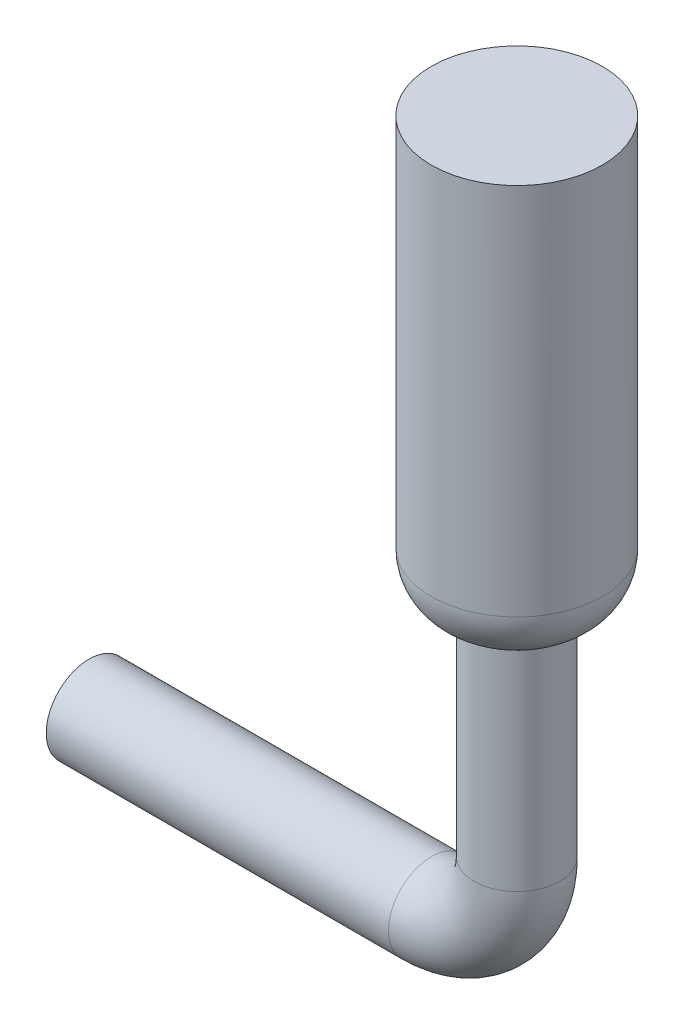
ISO-10303-21;
HEADER;
FILE_DESCRIPTION(('STEP AP214'),'2;1');
FILE_NAME('part.step','',(''),(''),'','','');
FILE_SCHEMA(('AUTOMOTIVE_DESIGN { 1 0 10303 214 1 1 1 1 }'));
ENDSEC;
DATA;
#1=APPLICATION_CONTEXT('core data for automotive mechanical design processes');
#2=APPLICATION_PROTOCOL_DEFINITION('international standard','automotive_design',2000,#1);
#3=PRODUCT_CONTEXT('',#1,'mechanical');
#4=PRODUCT('Part','Part','',(#3));
#5=PRODUCT_RELATED_PRODUCT_CATEGORY('part','',(#4));
#6=PRODUCT_DEFINITION_FORMATION('','',#4);
#7=PRODUCT_DEFINITION_CONTEXT('part definition',#1,'design');
#8=PRODUCT_DEFINITION('design','',#6,#7);
#9=PRODUCT_DEFINITION_SHAPE('','',#8);
#10=(LENGTH_UNIT() NAMED_UNIT(*) SI_UNIT(.MILLI.,.METRE.));
#11=(NAMED_UNIT(*) PLANE_ANGLE_UNIT() SI_UNIT($,.RADIAN.));
#12=(NAMED_UNIT(*) SI_UNIT($,.STERADIAN.) SOLID_ANGLE_UNIT());
#13=UNCERTAINTY_MEASURE_WITH_UNIT(LENGTH_MEASURE(1.E-05),#10,'distance_accuracy_value','');
#14=(GEOMETRIC_REPRESENTATION_CONTEXT(3) GLOBAL_UNCERTAINTY_ASSIGNED_CONTEXT((#13)) GLOBAL_UNIT_ASSIGNED_CONTEXT((#10,
#11,#12)) REPRESENTATION_CONTEXT('',''));
#15=CARTESIAN_POINT('',(0.,0.,0.));
#16=DIRECTION('',(0.,0.,1.));
#17=DIRECTION('',(1.,0.,0.));
#18=AXIS2_PLACEMENT_3D('',#15,#16,#17);
#19=CARTESIAN_POINT('',(-127.,0.,0.));
#20=DIRECTION('',(-1.,0.,0.));
#21=DIRECTION('',(0.,0.,-1.));
#22=AXIS2_PLACEMENT_3D('',#19,#20,#21);
#23=PLANE('',#22);
#24=CARTESIAN_POINT('',(-127.,0.,0.));
#25=DIRECTION('',(-1.,0.,0.));
#26=DIRECTION('',(0.,0.,-1.));
#27=AXIS2_PLACEMENT_3D('',#24,#25,#26);
#28=CIRCLE('',#27,12.7);
#29=CARTESIAN_POINT('',(-127.,0.,-12.7));
#30=VERTEX_POINT('',#29);
#31=EDGE_CURVE('E67',#30,#30,#28,.T.);
#32=ORIENTED_EDGE('',*,*,#31,.T.);
#33=EDGE_LOOP('',(#32));
#34=FACE_BOUND('',#33,.T.);
#35=ADVANCED_FACE('F51',(#34),#23,.T.);
#36=CARTESIAN_POINT('',(-127.,0.,0.));
#37=DIRECTION('',(1.,0.,0.));
#38=DIRECTION('',(0.,1.,0.));
#39=AXIS2_PLACEMENT_3D('',#36,#37,#38);
#40=CYLINDRICAL_SURFACE('',#39,12.7);
#41=CARTESIAN_POINT('',(-25.4000000000002,0.,0.));
#42=DIRECTION('',(-1.,0.,0.));
#43=DIRECTION('',(0.,0.,-1.));
#44=AXIS2_PLACEMENT_3D('',#41,#42,#43);
#45=CIRCLE('',#44,12.7);
#46=CARTESIAN_POINT('',(-25.4000000000003,-12.7,0.));
#47=VERTEX_POINT('',#46);
#48=EDGE_CURVE('E62',#47,#47,#45,.T.);
#49=ORIENTED_EDGE('',*,*,#48,.T.);
#50=EDGE_LOOP('',(#49));
#51=FACE_BOUND('',#50,.T.);
#52=ORIENTED_EDGE('',*,*,#31,.F.);
#53=EDGE_LOOP('',(#52));
#54=FACE_BOUND('',#53,.T.);
#55=ADVANCED_FACE('F96',(#51,#54),#40,.T.);
#56=CARTESIAN_POINT('',(-25.4,25.4,0.));
#57=DIRECTION('',(0.,0.,1.));
#58=DIRECTION('',(1.,0.,0.));
#59=AXIS2_PLACEMENT_3D('',#56,#57,#58);
#60=TOROIDAL_SURFACE('',#59,25.4,12.7);
#61=CARTESIAN_POINT('',(6.1929628092372E-13,25.4000000000002,0.));
#62=DIRECTION('',(0.,-1.,0.));
#63=DIRECTION('',(0.,0.,-1.));
#64=AXIS2_PLACEMENT_3D('',#61,#62,#63);
#65=CIRCLE('',#64,12.7);
#66=CARTESIAN_POINT('',(12.7,25.4000000000003,0.));
#67=VERTEX_POINT('',#66);
#68=EDGE_CURVE('E58',#67,#67,#65,.T.);
#69=CARTESIAN_POINT('',(-25.4,25.4,0.));
#70=DIRECTION('',(0.,0.,1.));
#71=DIRECTION('',(1.,0.,0.));
#72=AXIS2_PLACEMENT_3D('',#69,#70,#71);
#73=CIRCLE('',#72,38.1);
#74=EDGE_CURVE('',#47,#67,#73,.T.);
#75=ORIENTED_EDGE('',*,*,#48,.F.);
#76=ORIENTED_EDGE('',*,*,#68,.T.);
#77=ORIENTED_EDGE('',*,*,#74,.T.);
#78=ORIENTED_EDGE('',*,*,#74,.F.);
#79=EDGE_LOOP('',(#75,#77,#76,#78));
#80=FACE_BOUND('',#79,.T.);
#81=ADVANCED_FACE('F92',(#80),#60,.T.);
#82=CARTESIAN_POINT('',(0.,25.4000000000002,0.));
#83=DIRECTION('',(0.,1.,0.));
#84=DIRECTION('',(0.,0.,1.));
#85=AXIS2_PLACEMENT_3D('',#82,#83,#84);
#86=CYLINDRICAL_SURFACE('',#85,12.7);
#87=CARTESIAN_POINT('',(0.,88.9,0.));
#88=DIRECTION('',(0.,-1.,0.));
#89=DIRECTION('',(0.,0.,-1.));
#90=AXIS2_PLACEMENT_3D('',#87,#88,#89);
#91=CIRCLE('',#90,12.7);
#92=CARTESIAN_POINT('',(0.,88.9,-12.7));
#93=VERTEX_POINT('',#92);
#94=EDGE_CURVE('E70',#93,#93,#91,.T.);
#95=ORIENTED_EDGE('',*,*,#94,.T.);
#96=EDGE_LOOP('',(#95));
#97=FACE_BOUND('',#96,.T.);
#98=ORIENTED_EDGE('',*,*,#68,.F.);
#99=EDGE_LOOP('',(#98));
#100=FACE_BOUND('',#99,.T.);
#101=ADVANCED_FACE('F84',(#97,#100),#86,.T.);
#102=CARTESIAN_POINT('',(0.,215.9,0.));
#103=DIRECTION('',(0.,-1.,0.));
#104=DIRECTION('',(0.,0.,-1.));
#105=AXIS2_PLACEMENT_3D('',#102,#103,#104);
#106=CYLINDRICAL_SURFACE('',#105,25.4);
#107=CARTESIAN_POINT('',(0.,104.964370513655,0.));
#108=DIRECTION('',(0.,-1.,0.));
#109=DIRECTION('',(0.,0.,-1.));
#110=AXIS2_PLACEMENT_3D('',#107,#108,#109);
#111=CIRCLE('',#110,25.4);
#112=CARTESIAN_POINT('',(0.,104.964370513655,-25.4));
#113=VERTEX_POINT('',#112);
#114=EDGE_CURVE('E11',#113,#113,#111,.F.);
#115=ORIENTED_EDGE('',*,*,#114,.T.);
#116=EDGE_LOOP('',(#115));
#117=FACE_BOUND('',#116,.T.);
#118=CARTESIAN_POINT('',(0.,215.9,0.));
#119=DIRECTION('',(0.,1.,0.));
#120=DIRECTION('',(0.,0.,1.));
#121=AXIS2_PLACEMENT_3D('',#118,#119,#120);
#122=CIRCLE('',#121,25.4);
#123=CARTESIAN_POINT('',(0.,215.9,25.4));
#124=VERTEX_POINT('',#123);
#125=EDGE_CURVE('E72',#124,#124,#122,.T.);
#126=ORIENTED_EDGE('',*,*,#125,.F.);
#127=EDGE_LOOP('',(#126));
#128=FACE_BOUND('',#127,.T.);
#129=ADVANCED_FACE('F82',(#117,#128),#106,.T.);
#130=CARTESIAN_POINT('',(0.,215.9,0.));
#131=DIRECTION('',(0.,1.,0.));
#132=DIRECTION('',(0.,0.,1.));
#133=AXIS2_PLACEMENT_3D('',#130,#131,#132);
#134=PLANE('',#133);
#135=ORIENTED_EDGE('',*,*,#125,.T.);
#136=EDGE_LOOP('',(#135));
#137=FACE_BOUND('',#136,.T.);
#138=ADVANCED_FACE('F80',(#137),#134,.T.);
#139=CARTESIAN_POINT('',(0.,104.964370513655,0.));
#140=DIRECTION('',(0.,-1.,0.));
#141=DIRECTION('',(0.,0.,-1.));
#142=AXIS2_PLACEMENT_3D('',#139,#140,#141);
#143=DEGENERATE_TOROIDAL_SURFACE('',#142,8.89,16.51,.T.);
#144=ORIENTED_EDGE('',*,*,#94,.F.);
#145=EDGE_LOOP('',(#144));
#146=FACE_BOUND('',#145,.T.);
#147=ORIENTED_EDGE('',*,*,#114,.F.);
#148=EDGE_LOOP('',(#147));
#149=FACE_BOUND('',#148,.T.);
#150=ADVANCED_FACE('F53',(#146,#149),#143,.T.);
#151=CLOSED_SHELL('',(#35,#55,#81,#101,#129,#138,#150));
#152=MANIFOLD_SOLID_BREP('B2',#151);
#153=ADVANCED_BREP_SHAPE_REPRESENTATION('',(#18,#152),#14);
#154=SHAPE_DEFINITION_REPRESENTATION(#9,#153);
ENDSEC;
END-ISO-10303-21;
